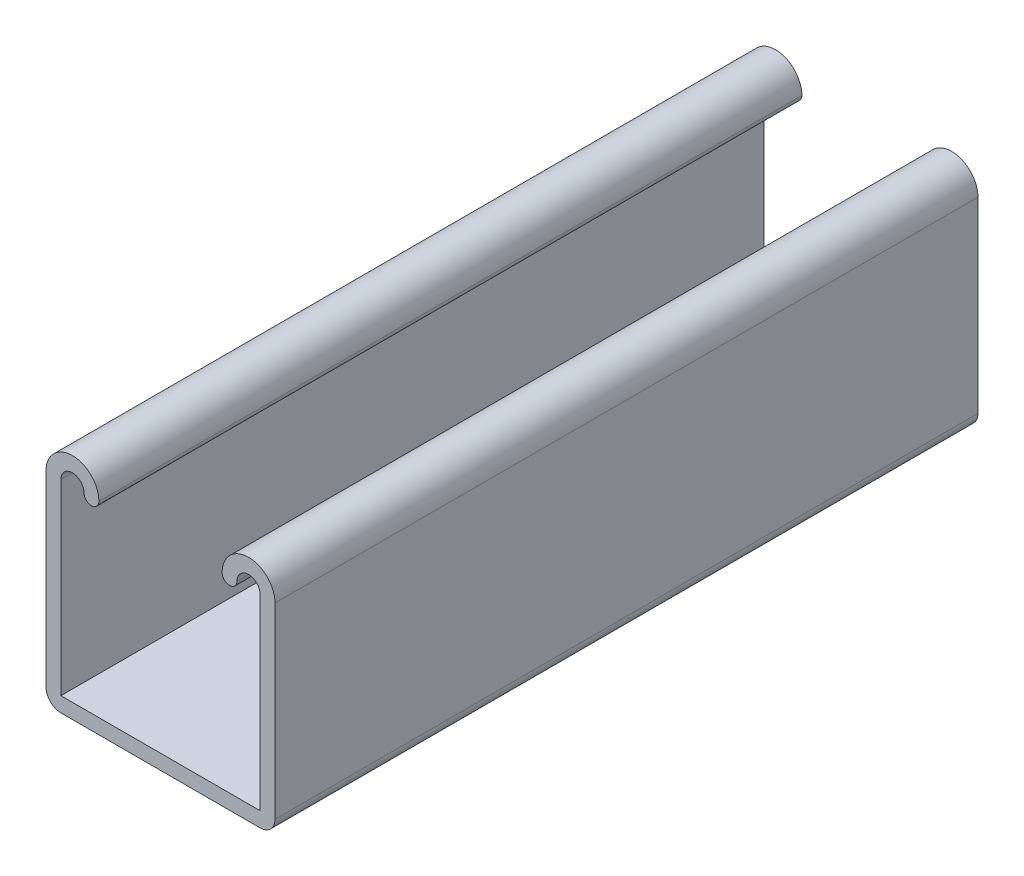
ISO-10303-21;
HEADER;
FILE_DESCRIPTION(('STEP AP214'),'2;1');
FILE_NAME('part.step','',(''),(''),'','','');
FILE_SCHEMA(('AUTOMOTIVE_DESIGN { 1 0 10303 214 1 1 1 1 }'));
ENDSEC;
DATA;
#1=APPLICATION_CONTEXT('core data for automotive mechanical design processes');
#2=APPLICATION_PROTOCOL_DEFINITION('international standard','automotive_design',2000,#1);
#3=PRODUCT_CONTEXT('',#1,'mechanical');
#4=PRODUCT('Part','Part','',(#3));
#5=PRODUCT_RELATED_PRODUCT_CATEGORY('part','',(#4));
#6=PRODUCT_DEFINITION_FORMATION('','',#4);
#7=PRODUCT_DEFINITION_CONTEXT('part definition',#1,'design');
#8=PRODUCT_DEFINITION('design','',#6,#7);
#9=PRODUCT_DEFINITION_SHAPE('','',#8);
#10=(LENGTH_UNIT() NAMED_UNIT(*) SI_UNIT(.MILLI.,.METRE.));
#11=(NAMED_UNIT(*) PLANE_ANGLE_UNIT() SI_UNIT($,.RADIAN.));
#12=(NAMED_UNIT(*) SI_UNIT($,.STERADIAN.) SOLID_ANGLE_UNIT());
#13=UNCERTAINTY_MEASURE_WITH_UNIT(LENGTH_MEASURE(1.E-05),#10,'distance_accuracy_value','');
#14=(GEOMETRIC_REPRESENTATION_CONTEXT(3) GLOBAL_UNCERTAINTY_ASSIGNED_CONTEXT((#13)) GLOBAL_UNIT_ASSIGNED_CONTEXT((#10,
#11,#12)) REPRESENTATION_CONTEXT('',''));
#15=CARTESIAN_POINT('',(0.,0.,0.));
#16=DIRECTION('',(0.,0.,1.));
#17=DIRECTION('',(1.,0.,0.));
#18=AXIS2_PLACEMENT_3D('',#15,#16,#17);
#19=CARTESIAN_POINT('',(0.,2.6924,127.));
#20=DIRECTION('',(0.,0.,-1.));
#21=DIRECTION('',(-1.,0.,0.));
#22=AXIS2_PLACEMENT_3D('',#19,#20,#21);
#23=CYLINDRICAL_SURFACE('',#22,2.6924);
#24=CARTESIAN_POINT('',(0.,2.6924,0.));
#25=DIRECTION('',(0.,0.,1.));
#26=DIRECTION('',(-1.,0.,0.));
#27=AXIS2_PLACEMENT_3D('',#24,#25,#26);
#28=CIRCLE('',#27,2.6924);
#29=CARTESIAN_POINT('',(-2.6924,2.6924,0.));
#30=VERTEX_POINT('',#29);
#31=CARTESIAN_POINT('',(0.,0.,0.));
#32=VERTEX_POINT('',#31);
#33=EDGE_CURVE('E165',#30,#32,#28,.T.);
#34=ORIENTED_EDGE('',*,*,#33,.T.);
#35=DIRECTION('',(0.,0.,-1.));
#36=VECTOR('',#35,1.);
#37=CARTESIAN_POINT('',(0.,0.,127.));
#38=LINE('',#37,#36);
#39=CARTESIAN_POINT('',(0.,0.,127.));
#40=VERTEX_POINT('',#39);
#41=EDGE_CURVE('E11',#40,#32,#38,.T.);
#42=ORIENTED_EDGE('',*,*,#41,.F.);
#43=CARTESIAN_POINT('',(0.,2.6924,127.));
#44=DIRECTION('',(0.,0.,1.));
#45=DIRECTION('',(-1.,0.,0.));
#46=AXIS2_PLACEMENT_3D('',#43,#44,#45);
#47=CIRCLE('',#46,2.6924);
#48=CARTESIAN_POINT('',(-2.6924,2.6924,127.));
#49=VERTEX_POINT('',#48);
#50=EDGE_CURVE('E191',#49,#40,#47,.T.);
#51=ORIENTED_EDGE('',*,*,#50,.F.);
#52=DIRECTION('',(0.,0.,-1.));
#53=VECTOR('',#52,1.);
#54=CARTESIAN_POINT('',(-2.6924,2.6924,127.));
#55=LINE('',#54,#53);
#56=EDGE_CURVE('E161',#49,#30,#55,.T.);
#57=ORIENTED_EDGE('',*,*,#56,.T.);
#58=EDGE_LOOP('',(#34,#42,#51,#57));
#59=FACE_BOUND('',#58,.T.);
#60=ADVANCED_FACE('F33',(#59),#23,.T.);
#61=CARTESIAN_POINT('',(0.,0.,127.));
#62=DIRECTION('',(0.,1.,0.));
#63=DIRECTION('',(0.,0.,1.));
#64=AXIS2_PLACEMENT_3D('',#61,#62,#63);
#65=PLANE('',#64);
#66=DIRECTION('',(1.,0.,0.));
#67=VECTOR('',#66,1.);
#68=CARTESIAN_POINT('',(0.,0.,0.));
#69=LINE('',#68,#67);
#70=CARTESIAN_POINT('',(35.98,0.,0.));
#71=VERTEX_POINT('',#70);
#72=EDGE_CURVE('E168',#32,#71,#69,.T.);
#73=ORIENTED_EDGE('',*,*,#72,.T.);
#74=DIRECTION('',(0.,0.,-1.));
#75=VECTOR('',#74,1.);
#76=CARTESIAN_POINT('',(35.98,0.,127.));
#77=LINE('',#76,#75);
#78=CARTESIAN_POINT('',(35.98,0.,127.));
#79=VERTEX_POINT('',#78);
#80=EDGE_CURVE('E41',#79,#71,#77,.T.);
#81=ORIENTED_EDGE('',*,*,#80,.F.);
#82=DIRECTION('',(1.,0.,0.));
#83=VECTOR('',#82,1.);
#84=CARTESIAN_POINT('',(0.,0.,127.));
#85=LINE('',#84,#83);
#86=EDGE_CURVE('E110',#40,#79,#85,.T.);
#87=ORIENTED_EDGE('',*,*,#86,.F.);
#88=ORIENTED_EDGE('',*,*,#41,.T.);
#89=EDGE_LOOP('',(#73,#81,#87,#88));
#90=FACE_BOUND('',#89,.T.);
#91=ADVANCED_FACE('F279',(#90),#65,.F.);
#92=CARTESIAN_POINT('',(35.98,2.6924,127.));
#93=DIRECTION('',(0.,0.,-1.));
#94=DIRECTION('',(-1.,0.,0.));
#95=AXIS2_PLACEMENT_3D('',#92,#93,#94);
#96=CYLINDRICAL_SURFACE('',#95,2.6924);
#97=CARTESIAN_POINT('',(35.98,2.6924,0.));
#98=DIRECTION('',(0.,0.,1.));
#99=DIRECTION('',(1.,0.,0.));
#100=AXIS2_PLACEMENT_3D('',#97,#98,#99);
#101=CIRCLE('',#100,2.6924);
#102=CARTESIAN_POINT('',(38.6724,2.6924,0.));
#103=VERTEX_POINT('',#102);
#104=EDGE_CURVE('E170',#71,#103,#101,.T.);
#105=ORIENTED_EDGE('',*,*,#104,.T.);
#106=DIRECTION('',(0.,0.,-1.));
#107=VECTOR('',#106,1.);
#108=CARTESIAN_POINT('',(38.6724,2.6924,127.));
#109=LINE('',#108,#107);
#110=CARTESIAN_POINT('',(38.6724,2.6924,127.));
#111=VERTEX_POINT('',#110);
#112=EDGE_CURVE('E216',#111,#103,#109,.T.);
#113=ORIENTED_EDGE('',*,*,#112,.F.);
#114=CARTESIAN_POINT('',(35.98,2.6924,127.));
#115=DIRECTION('',(0.,0.,1.));
#116=DIRECTION('',(1.,0.,0.));
#117=AXIS2_PLACEMENT_3D('',#114,#115,#116);
#118=CIRCLE('',#117,2.6924);
#119=EDGE_CURVE('E224',#79,#111,#118,.T.);
#120=ORIENTED_EDGE('',*,*,#119,.F.);
#121=ORIENTED_EDGE('',*,*,#80,.T.);
#122=EDGE_LOOP('',(#105,#113,#120,#121));
#123=FACE_BOUND('',#122,.T.);
#124=ADVANCED_FACE('F222',(#123),#96,.T.);
#125=CARTESIAN_POINT('',(38.6724,2.6924,127.));
#126=DIRECTION('',(-1.,0.,0.));
#127=DIRECTION('',(0.,0.,1.));
#128=AXIS2_PLACEMENT_3D('',#125,#126,#127);
#129=PLANE('',#128);
#130=DIRECTION('',(0.,1.,0.));
#131=VECTOR('',#130,1.);
#132=CARTESIAN_POINT('',(38.6724,2.6924,0.));
#133=LINE('',#132,#131);
#134=CARTESIAN_POINT('',(38.6724,36.5252,0.));
#135=VERTEX_POINT('',#134);
#136=EDGE_CURVE('E172',#103,#135,#133,.T.);
#137=ORIENTED_EDGE('',*,*,#136,.T.);
#138=DIRECTION('',(0.,0.,-1.));
#139=VECTOR('',#138,1.);
#140=CARTESIAN_POINT('',(38.6724,36.5252,127.));
#141=LINE('',#140,#139);
#142=CARTESIAN_POINT('',(38.6724,36.5252,127.));
#143=VERTEX_POINT('',#142);
#144=EDGE_CURVE('E213',#143,#135,#141,.T.);
#145=ORIENTED_EDGE('',*,*,#144,.F.);
#146=DIRECTION('',(0.,1.,0.));
#147=VECTOR('',#146,1.);
#148=CARTESIAN_POINT('',(38.6724,2.6924,127.));
#149=LINE('',#148,#147);
#150=EDGE_CURVE('E242',#111,#143,#149,.T.);
#151=ORIENTED_EDGE('',*,*,#150,.F.);
#152=ORIENTED_EDGE('',*,*,#112,.T.);
#153=EDGE_LOOP('',(#137,#145,#151,#152));
#154=FACE_BOUND('',#153,.T.);
#155=ADVANCED_FACE('F233',(#154),#129,.F.);
#156=CARTESIAN_POINT('',(33.8972,36.5252,127.));
#157=DIRECTION('',(0.,0.,-1.));
#158=DIRECTION('',(-1.,0.,0.));
#159=AXIS2_PLACEMENT_3D('',#156,#157,#158);
#160=CYLINDRICAL_SURFACE('',#159,4.7752);
#161=CARTESIAN_POINT('',(33.8972,36.5252,0.));
#162=DIRECTION('',(0.,0.,1.));
#163=DIRECTION('',(1.,0.,0.));
#164=AXIS2_PLACEMENT_3D('',#161,#162,#163);
#165=CIRCLE('',#164,4.7752);
#166=CARTESIAN_POINT('',(29.122,36.5252,0.));
#167=VERTEX_POINT('',#166);
#168=EDGE_CURVE('E174',#135,#167,#165,.T.);
#169=ORIENTED_EDGE('',*,*,#168,.T.);
#170=DIRECTION('',(0.,0.,-1.));
#171=VECTOR('',#170,1.);
#172=CARTESIAN_POINT('',(29.122,36.5252,127.));
#173=LINE('',#172,#171);
#174=CARTESIAN_POINT('',(29.122,36.5252,127.));
#175=VERTEX_POINT('',#174);
#176=EDGE_CURVE('E210',#175,#167,#173,.T.);
#177=ORIENTED_EDGE('',*,*,#176,.F.);
#178=CARTESIAN_POINT('',(33.8972,36.5252,127.));
#179=DIRECTION('',(0.,0.,1.));
#180=DIRECTION('',(1.,0.,0.));
#181=AXIS2_PLACEMENT_3D('',#178,#179,#180);
#182=CIRCLE('',#181,4.7752);
#183=EDGE_CURVE('E239',#143,#175,#182,.T.);
#184=ORIENTED_EDGE('',*,*,#183,.F.);
#185=ORIENTED_EDGE('',*,*,#144,.T.);
#186=EDGE_LOOP('',(#169,#177,#184,#185));
#187=FACE_BOUND('',#186,.T.);
#188=ADVANCED_FACE('F237',(#187),#160,.T.);
#189=CARTESIAN_POINT('',(30.4682,36.5252,127.));
#190=DIRECTION('',(0.,0.,-1.));
#191=DIRECTION('',(-1.,0.,0.));
#192=AXIS2_PLACEMENT_3D('',#189,#190,#191);
#193=CYLINDRICAL_SURFACE('',#192,1.3462);
#194=CARTESIAN_POINT('',(30.4682,36.5252,0.));
#195=DIRECTION('',(0.,0.,1.));
#196=DIRECTION('',(1.,0.,0.));
#197=AXIS2_PLACEMENT_3D('',#194,#195,#196);
#198=CIRCLE('',#197,1.3462);
#199=CARTESIAN_POINT('',(31.8144,36.5252,0.));
#200=VERTEX_POINT('',#199);
#201=EDGE_CURVE('E176',#167,#200,#198,.T.);
#202=ORIENTED_EDGE('',*,*,#201,.T.);
#203=DIRECTION('',(0.,0.,-1.));
#204=VECTOR('',#203,1.);
#205=CARTESIAN_POINT('',(31.8144,36.5252,127.));
#206=LINE('',#205,#204);
#207=CARTESIAN_POINT('',(31.8144,36.5252,127.));
#208=VERTEX_POINT('',#207);
#209=EDGE_CURVE('E207',#208,#200,#206,.T.);
#210=ORIENTED_EDGE('',*,*,#209,.F.);
#211=CARTESIAN_POINT('',(30.4682,36.5252,127.));
#212=DIRECTION('',(0.,0.,1.));
#213=DIRECTION('',(1.,0.,0.));
#214=AXIS2_PLACEMENT_3D('',#211,#212,#213);
#215=CIRCLE('',#214,1.3462);
#216=EDGE_CURVE('E241',#175,#208,#215,.T.);
#217=ORIENTED_EDGE('',*,*,#216,.F.);
#218=ORIENTED_EDGE('',*,*,#176,.T.);
#219=EDGE_LOOP('',(#202,#210,#217,#218));
#220=FACE_BOUND('',#219,.T.);
#221=ADVANCED_FACE('F292',(#220),#193,.T.);
#222=CARTESIAN_POINT('',(33.8972,36.5252,127.));
#223=DIRECTION('',(0.,0.,-1.));
#224=DIRECTION('',(-1.,0.,0.));
#225=AXIS2_PLACEMENT_3D('',#222,#223,#224);
#226=CYLINDRICAL_SURFACE('',#225,2.0828);
#227=CARTESIAN_POINT('',(33.8972,36.5252,0.));
#228=DIRECTION('',(0.,0.,-1.));
#229=DIRECTION('',(1.,0.,0.));
#230=AXIS2_PLACEMENT_3D('',#227,#228,#229);
#231=CIRCLE('',#230,2.0828);
#232=CARTESIAN_POINT('',(35.98,36.5252,0.));
#233=VERTEX_POINT('',#232);
#234=EDGE_CURVE('E178',#200,#233,#231,.T.);
#235=ORIENTED_EDGE('',*,*,#234,.T.);
#236=DIRECTION('',(0.,0.,-1.));
#237=VECTOR('',#236,1.);
#238=CARTESIAN_POINT('',(35.98,36.5252,127.));
#239=LINE('',#238,#237);
#240=CARTESIAN_POINT('',(35.98,36.5252,127.));
#241=VERTEX_POINT('',#240);
#242=EDGE_CURVE('E204',#241,#233,#239,.T.);
#243=ORIENTED_EDGE('',*,*,#242,.F.);
#244=CARTESIAN_POINT('',(33.8972,36.5252,127.));
#245=DIRECTION('',(0.,0.,-1.));
#246=DIRECTION('',(1.,0.,0.));
#247=AXIS2_PLACEMENT_3D('',#244,#245,#246);
#248=CIRCLE('',#247,2.0828);
#249=EDGE_CURVE('E244',#208,#241,#248,.T.);
#250=ORIENTED_EDGE('',*,*,#249,.F.);
#251=ORIENTED_EDGE('',*,*,#209,.T.);
#252=EDGE_LOOP('',(#235,#243,#250,#251));
#253=FACE_BOUND('',#252,.T.);
#254=ADVANCED_FACE('F295',(#253),#226,.F.);
#255=CARTESIAN_POINT('',(35.98,2.6924,127.));
#256=DIRECTION('',(1.,0.,0.));
#257=DIRECTION('',(0.,0.,-1.));
#258=AXIS2_PLACEMENT_3D('',#255,#256,#257);
#259=PLANE('',#258);
#260=DIRECTION('',(0.,-1.,0.));
#261=VECTOR('',#260,1.);
#262=CARTESIAN_POINT('',(35.98,2.6924,0.));
#263=LINE('',#262,#261);
#264=CARTESIAN_POINT('',(35.98,2.6924,0.));
#265=VERTEX_POINT('',#264);
#266=EDGE_CURVE('E180',#233,#265,#263,.T.);
#267=ORIENTED_EDGE('',*,*,#266,.T.);
#268=DIRECTION('',(0.,0.,-1.));
#269=VECTOR('',#268,1.);
#270=CARTESIAN_POINT('',(35.98,2.6924,127.));
#271=LINE('',#270,#269);
#272=CARTESIAN_POINT('',(35.98,2.6924,127.));
#273=VERTEX_POINT('',#272);
#274=EDGE_CURVE('E201',#273,#265,#271,.T.);
#275=ORIENTED_EDGE('',*,*,#274,.F.);
#276=DIRECTION('',(0.,-1.,0.));
#277=VECTOR('',#276,1.);
#278=CARTESIAN_POINT('',(35.98,2.6924,127.));
#279=LINE('',#278,#277);
#280=EDGE_CURVE('E250',#241,#273,#279,.T.);
#281=ORIENTED_EDGE('',*,*,#280,.F.);
#282=ORIENTED_EDGE('',*,*,#242,.T.);
#283=EDGE_LOOP('',(#267,#275,#281,#282));
#284=FACE_BOUND('',#283,.T.);
#285=ADVANCED_FACE('F299',(#284),#259,.F.);
#286=CARTESIAN_POINT('',(35.98,2.6924,127.));
#287=DIRECTION('',(0.,-1.,0.));
#288=DIRECTION('',(0.,0.,-1.));
#289=AXIS2_PLACEMENT_3D('',#286,#287,#288);
#290=PLANE('',#289);
#291=DIRECTION('',(-1.,0.,0.));
#292=VECTOR('',#291,1.);
#293=CARTESIAN_POINT('',(35.98,2.6924,0.));
#294=LINE('',#293,#292);
#295=CARTESIAN_POINT('',(0.,2.6924,0.));
#296=VERTEX_POINT('',#295);
#297=EDGE_CURVE('E182',#265,#296,#294,.T.);
#298=ORIENTED_EDGE('',*,*,#297,.T.);
#299=DIRECTION('',(0.,0.,-1.));
#300=VECTOR('',#299,1.);
#301=CARTESIAN_POINT('',(0.,2.6924,127.));
#302=LINE('',#301,#300);
#303=CARTESIAN_POINT('',(0.,2.6924,127.));
#304=VERTEX_POINT('',#303);
#305=EDGE_CURVE('E198',#304,#296,#302,.T.);
#306=ORIENTED_EDGE('',*,*,#305,.F.);
#307=DIRECTION('',(-1.,0.,0.));
#308=VECTOR('',#307,1.);
#309=CARTESIAN_POINT('',(35.98,2.6924,127.));
#310=LINE('',#309,#308);
#311=EDGE_CURVE('E252',#273,#304,#310,.T.);
#312=ORIENTED_EDGE('',*,*,#311,.F.);
#313=ORIENTED_EDGE('',*,*,#274,.T.);
#314=EDGE_LOOP('',(#298,#306,#312,#313));
#315=FACE_BOUND('',#314,.T.);
#316=ADVANCED_FACE('F303',(#315),#290,.F.);
#317=CARTESIAN_POINT('',(0.,2.6924,127.));
#318=DIRECTION('',(-1.,0.,0.));
#319=DIRECTION('',(0.,0.,1.));
#320=AXIS2_PLACEMENT_3D('',#317,#318,#319);
#321=PLANE('',#320);
#322=DIRECTION('',(0.,1.,0.));
#323=VECTOR('',#322,1.);
#324=CARTESIAN_POINT('',(0.,2.6924,0.));
#325=LINE('',#324,#323);
#326=CARTESIAN_POINT('',(0.,36.5252,0.));
#327=VERTEX_POINT('',#326);
#328=EDGE_CURVE('E184',#296,#327,#325,.T.);
#329=ORIENTED_EDGE('',*,*,#328,.T.);
#330=DIRECTION('',(0.,0.,-1.));
#331=VECTOR('',#330,1.);
#332=CARTESIAN_POINT('',(0.,36.5252,127.));
#333=LINE('',#332,#331);
#334=CARTESIAN_POINT('',(0.,36.5252,127.));
#335=VERTEX_POINT('',#334);
#336=EDGE_CURVE('E195',#335,#327,#333,.T.);
#337=ORIENTED_EDGE('',*,*,#336,.F.);
#338=DIRECTION('',(0.,1.,0.));
#339=VECTOR('',#338,1.);
#340=CARTESIAN_POINT('',(0.,2.6924,127.));
#341=LINE('',#340,#339);
#342=EDGE_CURVE('E254',#304,#335,#341,.T.);
#343=ORIENTED_EDGE('',*,*,#342,.F.);
#344=ORIENTED_EDGE('',*,*,#305,.T.);
#345=EDGE_LOOP('',(#329,#337,#343,#344));
#346=FACE_BOUND('',#345,.T.);
#347=ADVANCED_FACE('F260',(#346),#321,.F.);
#348=CARTESIAN_POINT('',(2.0828,36.5252,127.));
#349=DIRECTION('',(0.,0.,-1.));
#350=DIRECTION('',(-1.,0.,0.));
#351=AXIS2_PLACEMENT_3D('',#348,#349,#350);
#352=CYLINDRICAL_SURFACE('',#351,2.0828);
#353=CARTESIAN_POINT('',(2.0828,36.5252,0.));
#354=DIRECTION('',(0.,0.,-1.));
#355=DIRECTION('',(-1.,0.,0.));
#356=AXIS2_PLACEMENT_3D('',#353,#354,#355);
#357=CIRCLE('',#356,2.0828);
#358=CARTESIAN_POINT('',(4.16560000000001,36.5252,0.));
#359=VERTEX_POINT('',#358);
#360=EDGE_CURVE('E186',#327,#359,#357,.T.);
#361=ORIENTED_EDGE('',*,*,#360,.T.);
#362=DIRECTION('',(0.,0.,-1.));
#363=VECTOR('',#362,1.);
#364=CARTESIAN_POINT('',(4.16560000000001,36.5252,127.));
#365=LINE('',#364,#363);
#366=CARTESIAN_POINT('',(4.16560000000001,36.5252,127.));
#367=VERTEX_POINT('',#366);
#368=EDGE_CURVE('E156',#367,#359,#365,.T.);
#369=ORIENTED_EDGE('',*,*,#368,.F.);
#370=CARTESIAN_POINT('',(2.0828,36.5252,127.));
#371=DIRECTION('',(0.,0.,-1.));
#372=DIRECTION('',(-1.,0.,0.));
#373=AXIS2_PLACEMENT_3D('',#370,#371,#372);
#374=CIRCLE('',#373,2.0828);
#375=EDGE_CURVE('E147',#335,#367,#374,.T.);
#376=ORIENTED_EDGE('',*,*,#375,.F.);
#377=ORIENTED_EDGE('',*,*,#336,.T.);
#378=EDGE_LOOP('',(#361,#369,#376,#377));
#379=FACE_BOUND('',#378,.T.);
#380=ADVANCED_FACE('F264',(#379),#352,.F.);
#381=CARTESIAN_POINT('',(5.5118,36.5252,127.));
#382=DIRECTION('',(0.,0.,-1.));
#383=DIRECTION('',(-1.,0.,0.));
#384=AXIS2_PLACEMENT_3D('',#381,#382,#383);
#385=CYLINDRICAL_SURFACE('',#384,1.3462);
#386=CARTESIAN_POINT('',(5.5118,36.5252,0.));
#387=DIRECTION('',(0.,0.,1.));
#388=DIRECTION('',(-1.,0.,0.));
#389=AXIS2_PLACEMENT_3D('',#386,#387,#388);
#390=CIRCLE('',#389,1.3462);
#391=CARTESIAN_POINT('',(6.858,36.5252,0.));
#392=VERTEX_POINT('',#391);
#393=EDGE_CURVE('E155',#359,#392,#390,.T.);
#394=ORIENTED_EDGE('',*,*,#393,.T.);
#395=DIRECTION('',(0.,0.,-1.));
#396=VECTOR('',#395,1.);
#397=CARTESIAN_POINT('',(6.858,36.5252,127.));
#398=LINE('',#397,#396);
#399=CARTESIAN_POINT('',(6.858,36.5252,127.));
#400=VERTEX_POINT('',#399);
#401=EDGE_CURVE('E152',#400,#392,#398,.T.);
#402=ORIENTED_EDGE('',*,*,#401,.F.);
#403=CARTESIAN_POINT('',(5.5118,36.5252,127.));
#404=DIRECTION('',(0.,0.,1.));
#405=DIRECTION('',(-1.,0.,0.));
#406=AXIS2_PLACEMENT_3D('',#403,#404,#405);
#407=CIRCLE('',#406,1.3462);
#408=EDGE_CURVE('E141',#367,#400,#407,.T.);
#409=ORIENTED_EDGE('',*,*,#408,.F.);
#410=ORIENTED_EDGE('',*,*,#368,.T.);
#411=EDGE_LOOP('',(#394,#402,#409,#410));
#412=FACE_BOUND('',#411,.T.);
#413=ADVANCED_FACE('F153',(#412),#385,.T.);
#414=CARTESIAN_POINT('',(2.0828,36.5252,127.));
#415=DIRECTION('',(0.,0.,-1.));
#416=DIRECTION('',(-1.,0.,0.));
#417=AXIS2_PLACEMENT_3D('',#414,#415,#416);
#418=CYLINDRICAL_SURFACE('',#417,4.7752);
#419=CARTESIAN_POINT('',(2.0828,36.5252,0.));
#420=DIRECTION('',(0.,0.,1.));
#421=DIRECTION('',(-1.,0.,0.));
#422=AXIS2_PLACEMENT_3D('',#419,#420,#421);
#423=CIRCLE('',#422,4.7752);
#424=CARTESIAN_POINT('',(-2.6924,36.5252,0.));
#425=VERTEX_POINT('',#424);
#426=EDGE_CURVE('E96',#392,#425,#423,.T.);
#427=ORIENTED_EDGE('',*,*,#426,.T.);
#428=DIRECTION('',(0.,0.,-1.));
#429=VECTOR('',#428,1.);
#430=CARTESIAN_POINT('',(-2.6924,36.5252,127.));
#431=LINE('',#430,#429);
#432=CARTESIAN_POINT('',(-2.6924,36.5252,127.));
#433=VERTEX_POINT('',#432);
#434=EDGE_CURVE('E157',#433,#425,#431,.T.);
#435=ORIENTED_EDGE('',*,*,#434,.F.);
#436=CARTESIAN_POINT('',(2.0828,36.5252,127.));
#437=DIRECTION('',(0.,0.,1.));
#438=DIRECTION('',(-1.,0.,0.));
#439=AXIS2_PLACEMENT_3D('',#436,#437,#438);
#440=CIRCLE('',#439,4.7752);
#441=EDGE_CURVE('E145',#400,#433,#440,.T.);
#442=ORIENTED_EDGE('',*,*,#441,.F.);
#443=ORIENTED_EDGE('',*,*,#401,.T.);
#444=EDGE_LOOP('',(#427,#435,#442,#443));
#445=FACE_BOUND('',#444,.T.);
#446=ADVANCED_FACE('F159',(#445),#418,.T.);
#447=CARTESIAN_POINT('',(-2.6924,2.6924,127.));
#448=DIRECTION('',(1.,0.,0.));
#449=DIRECTION('',(0.,0.,-1.));
#450=AXIS2_PLACEMENT_3D('',#447,#448,#449);
#451=PLANE('',#450);
#452=DIRECTION('',(0.,-1.,0.));
#453=VECTOR('',#452,1.);
#454=CARTESIAN_POINT('',(-2.6924,2.6924,0.));
#455=LINE('',#454,#453);
#456=EDGE_CURVE('E102',#425,#30,#455,.T.);
#457=ORIENTED_EDGE('',*,*,#456,.T.);
#458=ORIENTED_EDGE('',*,*,#56,.F.);
#459=DIRECTION('',(0.,-1.,0.));
#460=VECTOR('',#459,1.);
#461=CARTESIAN_POINT('',(-2.6924,2.6924,127.));
#462=LINE('',#461,#460);
#463=EDGE_CURVE('E49',#433,#49,#462,.T.);
#464=ORIENTED_EDGE('',*,*,#463,.F.);
#465=ORIENTED_EDGE('',*,*,#434,.T.);
#466=EDGE_LOOP('',(#457,#458,#464,#465));
#467=FACE_BOUND('',#466,.T.);
#468=ADVANCED_FACE('F268',(#467),#451,.F.);
#469=CARTESIAN_POINT('',(0.,2.6924,127.));
#470=DIRECTION('',(0.,0.,-1.));
#471=DIRECTION('',(-1.,0.,0.));
#472=AXIS2_PLACEMENT_3D('',#469,#470,#471);
#473=PLANE('',#472);
#474=ORIENTED_EDGE('',*,*,#50,.T.);
#475=ORIENTED_EDGE('',*,*,#86,.T.);
#476=ORIENTED_EDGE('',*,*,#119,.T.);
#477=ORIENTED_EDGE('',*,*,#150,.T.);
#478=ORIENTED_EDGE('',*,*,#183,.T.);
#479=ORIENTED_EDGE('',*,*,#216,.T.);
#480=ORIENTED_EDGE('',*,*,#249,.T.);
#481=ORIENTED_EDGE('',*,*,#280,.T.);
#482=ORIENTED_EDGE('',*,*,#311,.T.);
#483=ORIENTED_EDGE('',*,*,#342,.T.);
#484=ORIENTED_EDGE('',*,*,#375,.T.);
#485=ORIENTED_EDGE('',*,*,#408,.T.);
#486=ORIENTED_EDGE('',*,*,#441,.T.);
#487=ORIENTED_EDGE('',*,*,#463,.T.);
#488=EDGE_LOOP('',(#474,#475,#476,#477,#478,#479,#480,#481,#482,#483,#484,#485,#486,#487));
#489=FACE_BOUND('',#488,.T.);
#490=ADVANCED_FACE('F143',(#489),#473,.F.);
#491=CARTESIAN_POINT('',(0.,2.6924,0.));
#492=DIRECTION('',(0.,0.,-1.));
#493=DIRECTION('',(-1.,0.,0.));
#494=AXIS2_PLACEMENT_3D('',#491,#492,#493);
#495=PLANE('',#494);
#496=ORIENTED_EDGE('',*,*,#33,.F.);
#497=ORIENTED_EDGE('',*,*,#456,.F.);
#498=ORIENTED_EDGE('',*,*,#426,.F.);
#499=ORIENTED_EDGE('',*,*,#393,.F.);
#500=ORIENTED_EDGE('',*,*,#360,.F.);
#501=ORIENTED_EDGE('',*,*,#328,.F.);
#502=ORIENTED_EDGE('',*,*,#297,.F.);
#503=ORIENTED_EDGE('',*,*,#266,.F.);
#504=ORIENTED_EDGE('',*,*,#234,.F.);
#505=ORIENTED_EDGE('',*,*,#201,.F.);
#506=ORIENTED_EDGE('',*,*,#168,.F.);
#507=ORIENTED_EDGE('',*,*,#136,.F.);
#508=ORIENTED_EDGE('',*,*,#104,.F.);
#509=ORIENTED_EDGE('',*,*,#72,.F.);
#510=EDGE_LOOP('',(#496,#497,#498,#499,#500,#501,#502,#503,#504,#505,#506,#507,#508,#509));
#511=FACE_BOUND('',#510,.T.);
#512=ADVANCED_FACE('F228',(#511),#495,.T.);
#513=CLOSED_SHELL('',(#60,#91,#124,#155,#188,#221,#254,#285,#316,#347,#380,#413,#446,#468,#490,#512));
#514=MANIFOLD_SOLID_BREP('B2',#513);
#515=ADVANCED_BREP_SHAPE_REPRESENTATION('',(#18,#514),#14);
#516=SHAPE_DEFINITION_REPRESENTATION(#9,#515);
ENDSEC;
END-ISO-10303-21;
